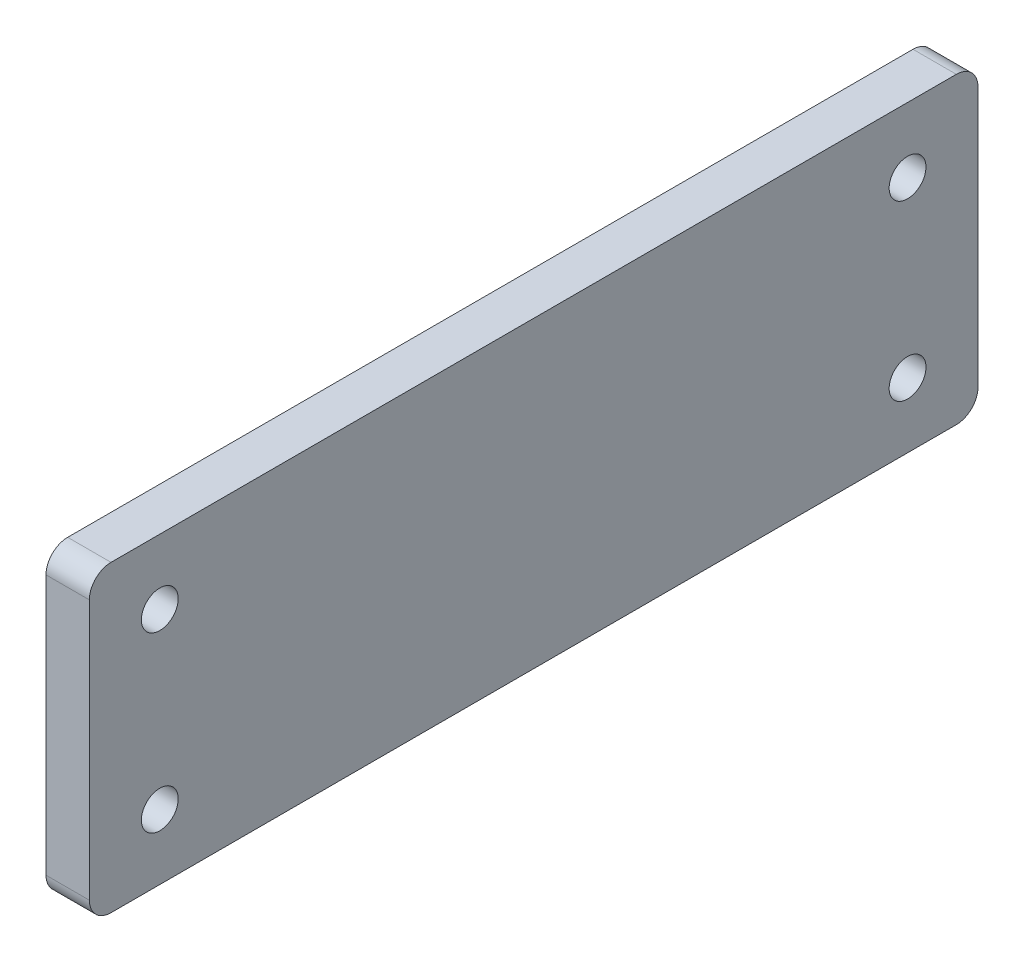
ISO-10303-21;
HEADER;
FILE_DESCRIPTION(('STEP AP214'),'2;1');
FILE_NAME('part.step','',(''),(''),'','','');
FILE_SCHEMA(('AUTOMOTIVE_DESIGN { 1 0 10303 214 1 1 1 1 }'));
ENDSEC;
DATA;
#1=APPLICATION_CONTEXT('core data for automotive mechanical design processes');
#2=APPLICATION_PROTOCOL_DEFINITION('international standard','automotive_design',2000,#1);
#3=PRODUCT_CONTEXT('',#1,'mechanical');
#4=PRODUCT('Part','Part','',(#3));
#5=PRODUCT_RELATED_PRODUCT_CATEGORY('part','',(#4));
#6=PRODUCT_DEFINITION_FORMATION('','',#4);
#7=PRODUCT_DEFINITION_CONTEXT('part definition',#1,'design');
#8=PRODUCT_DEFINITION('design','',#6,#7);
#9=PRODUCT_DEFINITION_SHAPE('','',#8);
#10=(LENGTH_UNIT() NAMED_UNIT(*) SI_UNIT(.MILLI.,.METRE.));
#11=(NAMED_UNIT(*) PLANE_ANGLE_UNIT() SI_UNIT($,.RADIAN.));
#12=(NAMED_UNIT(*) SI_UNIT($,.STERADIAN.) SOLID_ANGLE_UNIT());
#13=UNCERTAINTY_MEASURE_WITH_UNIT(LENGTH_MEASURE(1.E-05),#10,'distance_accuracy_value','');
#14=(GEOMETRIC_REPRESENTATION_CONTEXT(3) GLOBAL_UNCERTAINTY_ASSIGNED_CONTEXT((#13)) GLOBAL_UNIT_ASSIGNED_CONTEXT((#10,
#11,#12)) REPRESENTATION_CONTEXT('',''));
#15=CARTESIAN_POINT('',(0.,0.,0.));
#16=DIRECTION('',(0.,0.,1.));
#17=DIRECTION('',(1.,0.,0.));
#18=AXIS2_PLACEMENT_3D('',#15,#16,#17);
#19=CARTESIAN_POINT('',(2.,-6.,19.5));
#20=DIRECTION('',(1.,0.,0.));
#21=DIRECTION('',(0.,0.,-1.));
#22=AXIS2_PLACEMENT_3D('',#19,#20,#21);
#23=PLANE('',#22);
#24=CARTESIAN_POINT('',(2.,-4.,-17.25));
#25=DIRECTION('',(1.,0.,0.));
#26=DIRECTION('',(0.,0.,-1.));
#27=AXIS2_PLACEMENT_3D('',#24,#25,#26);
#28=CIRCLE('',#27,0.85);
#29=CARTESIAN_POINT('',(2.,-4.,-18.1));
#30=VERTEX_POINT('',#29);
#31=EDGE_CURVE('E189',#30,#30,#28,.T.);
#32=ORIENTED_EDGE('',*,*,#31,.F.);
#33=EDGE_LOOP('',(#32));
#34=FACE_BOUND('',#33,.T.);
#35=CARTESIAN_POINT('',(2.,3.99999999999999,17.25));
#36=DIRECTION('',(1.,0.,0.));
#37=DIRECTION('',(0.,0.,-1.));
#38=AXIS2_PLACEMENT_3D('',#35,#36,#37);
#39=CIRCLE('',#38,0.85);
#40=CARTESIAN_POINT('',(2.,3.99999999999999,16.4));
#41=VERTEX_POINT('',#40);
#42=EDGE_CURVE('E135',#41,#41,#39,.T.);
#43=ORIENTED_EDGE('',*,*,#42,.F.);
#44=EDGE_LOOP('',(#43));
#45=FACE_BOUND('',#44,.T.);
#46=CARTESIAN_POINT('',(2.,-6.,19.5));
#47=DIRECTION('',(1.,0.,0.));
#48=DIRECTION('',(0.,0.,-1.));
#49=AXIS2_PLACEMENT_3D('',#46,#47,#48);
#50=CIRCLE('',#49,1.);
#51=CARTESIAN_POINT('',(2.,-5.99999999999999,20.5));
#52=VERTEX_POINT('',#51);
#53=CARTESIAN_POINT('',(2.,-7.,19.5));
#54=VERTEX_POINT('',#53);
#55=EDGE_CURVE('E146',#52,#54,#50,.T.);
#56=ORIENTED_EDGE('',*,*,#55,.T.);
#57=DIRECTION('',(0.,0.,-1.));
#58=VECTOR('',#57,1.);
#59=CARTESIAN_POINT('',(2.,-7.,19.5));
#60=LINE('',#59,#58);
#61=CARTESIAN_POINT('',(2.,-7.,-19.5));
#62=VERTEX_POINT('',#61);
#63=EDGE_CURVE('E94',#54,#62,#60,.T.);
#64=ORIENTED_EDGE('',*,*,#63,.T.);
#65=CARTESIAN_POINT('',(2.,-5.99999999999999,-19.5));
#66=DIRECTION('',(1.,0.,0.));
#67=DIRECTION('',(0.,0.,-1.));
#68=AXIS2_PLACEMENT_3D('',#65,#66,#67);
#69=CIRCLE('',#68,1.);
#70=CARTESIAN_POINT('',(2.,-5.99999999999999,-20.5));
#71=VERTEX_POINT('',#70);
#72=EDGE_CURVE('E161',#62,#71,#69,.T.);
#73=ORIENTED_EDGE('',*,*,#72,.T.);
#74=DIRECTION('',(0.,1.,0.));
#75=VECTOR('',#74,1.);
#76=CARTESIAN_POINT('',(2.,6.,-20.5));
#77=LINE('',#76,#75);
#78=CARTESIAN_POINT('',(2.,6.,-20.5));
#79=VERTEX_POINT('',#78);
#80=EDGE_CURVE('E174',#71,#79,#77,.T.);
#81=ORIENTED_EDGE('',*,*,#80,.T.);
#82=CARTESIAN_POINT('',(2.,6.00000000000001,-19.5));
#83=DIRECTION('',(1.,0.,0.));
#84=DIRECTION('',(0.,0.,1.));
#85=AXIS2_PLACEMENT_3D('',#82,#83,#84);
#86=CIRCLE('',#85,1.);
#87=CARTESIAN_POINT('',(2.,7.00000000000001,-19.5));
#88=VERTEX_POINT('',#87);
#89=EDGE_CURVE('E113',#79,#88,#86,.T.);
#90=ORIENTED_EDGE('',*,*,#89,.T.);
#91=DIRECTION('',(0.,0.,1.));
#92=VECTOR('',#91,1.);
#93=CARTESIAN_POINT('',(2.,7.,19.5));
#94=LINE('',#93,#92);
#95=CARTESIAN_POINT('',(2.,7.,19.5));
#96=VERTEX_POINT('',#95);
#97=EDGE_CURVE('E107',#88,#96,#94,.T.);
#98=ORIENTED_EDGE('',*,*,#97,.T.);
#99=CARTESIAN_POINT('',(2.,6.,19.5));
#100=DIRECTION('',(1.,0.,0.));
#101=DIRECTION('',(0.,0.,-1.));
#102=AXIS2_PLACEMENT_3D('',#99,#100,#101);
#103=CIRCLE('',#102,1.);
#104=CARTESIAN_POINT('',(2.,5.99999999999999,20.5));
#105=VERTEX_POINT('',#104);
#106=EDGE_CURVE('E111',#96,#105,#103,.T.);
#107=ORIENTED_EDGE('',*,*,#106,.T.);
#108=DIRECTION('',(0.,-1.,0.));
#109=VECTOR('',#108,1.);
#110=CARTESIAN_POINT('',(2.,5.99999999999999,20.5));
#111=LINE('',#110,#109);
#112=EDGE_CURVE('E51',#105,#52,#111,.T.);
#113=ORIENTED_EDGE('',*,*,#112,.T.);
#114=EDGE_LOOP('',(#56,#64,#73,#81,#90,#98,#107,#113));
#115=FACE_BOUND('',#114,.T.);
#116=CARTESIAN_POINT('',(2.,-4.00000000000001,17.25));
#117=DIRECTION('',(1.,0.,0.));
#118=DIRECTION('',(0.,0.,-1.));
#119=AXIS2_PLACEMENT_3D('',#116,#117,#118);
#120=CIRCLE('',#119,0.85);
#121=CARTESIAN_POINT('',(2.,-4.00000000000001,16.4));
#122=VERTEX_POINT('',#121);
#123=EDGE_CURVE('E183',#122,#122,#120,.T.);
#124=ORIENTED_EDGE('',*,*,#123,.F.);
#125=EDGE_LOOP('',(#124));
#126=FACE_BOUND('',#125,.T.);
#127=CARTESIAN_POINT('',(2.,4.,-17.25));
#128=DIRECTION('',(1.,0.,0.));
#129=DIRECTION('',(0.,0.,-1.));
#130=AXIS2_PLACEMENT_3D('',#127,#128,#129);
#131=CIRCLE('',#130,0.85);
#132=CARTESIAN_POINT('',(2.,4.,-18.1));
#133=VERTEX_POINT('',#132);
#134=EDGE_CURVE('E195',#133,#133,#131,.T.);
#135=ORIENTED_EDGE('',*,*,#134,.F.);
#136=EDGE_LOOP('',(#135));
#137=FACE_BOUND('',#136,.T.);
#138=ADVANCED_FACE('F34',(#34,#45,#115,#126,#137),#23,.T.);
#139=CARTESIAN_POINT('',(0.,-6.,19.5));
#140=DIRECTION('',(1.,0.,0.));
#141=DIRECTION('',(0.,0.,-1.));
#142=AXIS2_PLACEMENT_3D('',#139,#140,#141);
#143=PLANE('',#142);
#144=CARTESIAN_POINT('',(0.,-6.,19.5));
#145=DIRECTION('',(1.,0.,0.));
#146=DIRECTION('',(0.,0.,-1.));
#147=AXIS2_PLACEMENT_3D('',#144,#145,#146);
#148=CIRCLE('',#147,1.);
#149=CARTESIAN_POINT('',(0.,-5.99999999999999,20.5));
#150=VERTEX_POINT('',#149);
#151=CARTESIAN_POINT('',(0.,-7.,19.5));
#152=VERTEX_POINT('',#151);
#153=EDGE_CURVE('E131',#150,#152,#148,.T.);
#154=ORIENTED_EDGE('',*,*,#153,.F.);
#155=DIRECTION('',(0.,-1.,0.));
#156=VECTOR('',#155,1.);
#157=CARTESIAN_POINT('',(0.,5.99999999999999,20.5));
#158=LINE('',#157,#156);
#159=CARTESIAN_POINT('',(0.,5.99999999999999,20.5));
#160=VERTEX_POINT('',#159);
#161=EDGE_CURVE('E86',#160,#150,#158,.T.);
#162=ORIENTED_EDGE('',*,*,#161,.F.);
#163=CARTESIAN_POINT('',(0.,6.,19.5));
#164=DIRECTION('',(1.,0.,0.));
#165=DIRECTION('',(0.,0.,-1.));
#166=AXIS2_PLACEMENT_3D('',#163,#164,#165);
#167=CIRCLE('',#166,1.);
#168=CARTESIAN_POINT('',(0.,7.,19.5));
#169=VERTEX_POINT('',#168);
#170=EDGE_CURVE('E80',#169,#160,#167,.T.);
#171=ORIENTED_EDGE('',*,*,#170,.F.);
#172=DIRECTION('',(0.,0.,1.));
#173=VECTOR('',#172,1.);
#174=CARTESIAN_POINT('',(0.,7.,19.5));
#175=LINE('',#174,#173);
#176=CARTESIAN_POINT('',(0.,7.00000000000001,-19.5));
#177=VERTEX_POINT('',#176);
#178=EDGE_CURVE('E121',#177,#169,#175,.T.);
#179=ORIENTED_EDGE('',*,*,#178,.F.);
#180=CARTESIAN_POINT('',(0.,6.00000000000001,-19.5));
#181=DIRECTION('',(1.,0.,0.));
#182=DIRECTION('',(0.,0.,1.));
#183=AXIS2_PLACEMENT_3D('',#180,#181,#182);
#184=CIRCLE('',#183,1.);
#185=CARTESIAN_POINT('',(0.,6.,-20.5));
#186=VERTEX_POINT('',#185);
#187=EDGE_CURVE('E141',#186,#177,#184,.T.);
#188=ORIENTED_EDGE('',*,*,#187,.F.);
#189=DIRECTION('',(0.,1.,0.));
#190=VECTOR('',#189,1.);
#191=CARTESIAN_POINT('',(0.,6.,-20.5));
#192=LINE('',#191,#190);
#193=CARTESIAN_POINT('',(0.,-5.99999999999999,-20.5));
#194=VERTEX_POINT('',#193);
#195=EDGE_CURVE('E139',#194,#186,#192,.T.);
#196=ORIENTED_EDGE('',*,*,#195,.F.);
#197=CARTESIAN_POINT('',(0.,-5.99999999999999,-19.5));
#198=DIRECTION('',(1.,0.,0.));
#199=DIRECTION('',(0.,0.,-1.));
#200=AXIS2_PLACEMENT_3D('',#197,#198,#199);
#201=CIRCLE('',#200,1.);
#202=CARTESIAN_POINT('',(0.,-7.,-19.5));
#203=VERTEX_POINT('',#202);
#204=EDGE_CURVE('E137',#203,#194,#201,.T.);
#205=ORIENTED_EDGE('',*,*,#204,.F.);
#206=DIRECTION('',(0.,0.,-1.));
#207=VECTOR('',#206,1.);
#208=CARTESIAN_POINT('',(0.,-7.,19.5));
#209=LINE('',#208,#207);
#210=EDGE_CURVE('E134',#152,#203,#209,.T.);
#211=ORIENTED_EDGE('',*,*,#210,.F.);
#212=EDGE_LOOP('',(#154,#162,#171,#179,#188,#196,#205,#211));
#213=FACE_BOUND('',#212,.T.);
#214=CARTESIAN_POINT('',(0.,3.99999999999999,17.25));
#215=DIRECTION('',(1.,0.,0.));
#216=DIRECTION('',(0.,0.,-1.));
#217=AXIS2_PLACEMENT_3D('',#214,#215,#216);
#218=CIRCLE('',#217,0.85);
#219=CARTESIAN_POINT('',(0.,3.99999999999999,16.4));
#220=VERTEX_POINT('',#219);
#221=EDGE_CURVE('E180',#220,#220,#218,.T.);
#222=ORIENTED_EDGE('',*,*,#221,.T.);
#223=EDGE_LOOP('',(#222));
#224=FACE_BOUND('',#223,.T.);
#225=CARTESIAN_POINT('',(0.,-4.00000000000001,17.25));
#226=DIRECTION('',(1.,0.,0.));
#227=DIRECTION('',(0.,0.,-1.));
#228=AXIS2_PLACEMENT_3D('',#225,#226,#227);
#229=CIRCLE('',#228,0.85);
#230=CARTESIAN_POINT('',(0.,-4.00000000000001,16.4));
#231=VERTEX_POINT('',#230);
#232=EDGE_CURVE('E186',#231,#231,#229,.T.);
#233=ORIENTED_EDGE('',*,*,#232,.T.);
#234=EDGE_LOOP('',(#233));
#235=FACE_BOUND('',#234,.T.);
#236=CARTESIAN_POINT('',(0.,-4.,-17.25));
#237=DIRECTION('',(1.,0.,0.));
#238=DIRECTION('',(0.,0.,-1.));
#239=AXIS2_PLACEMENT_3D('',#236,#237,#238);
#240=CIRCLE('',#239,0.85);
#241=CARTESIAN_POINT('',(0.,-4.,-18.1));
#242=VERTEX_POINT('',#241);
#243=EDGE_CURVE('E192',#242,#242,#240,.T.);
#244=ORIENTED_EDGE('',*,*,#243,.T.);
#245=EDGE_LOOP('',(#244));
#246=FACE_BOUND('',#245,.T.);
#247=CARTESIAN_POINT('',(0.,4.,-17.25));
#248=DIRECTION('',(1.,0.,0.));
#249=DIRECTION('',(0.,0.,-1.));
#250=AXIS2_PLACEMENT_3D('',#247,#248,#249);
#251=CIRCLE('',#250,0.85);
#252=CARTESIAN_POINT('',(0.,4.,-18.1));
#253=VERTEX_POINT('',#252);
#254=EDGE_CURVE('E198',#253,#253,#251,.T.);
#255=ORIENTED_EDGE('',*,*,#254,.T.);
#256=EDGE_LOOP('',(#255));
#257=FACE_BOUND('',#256,.T.);
#258=ADVANCED_FACE('F165',(#213,#224,#235,#246,#257),#143,.F.);
#259=CARTESIAN_POINT('',(2.,-6.,19.5));
#260=DIRECTION('',(-1.,0.,0.));
#261=DIRECTION('',(0.,0.,1.));
#262=AXIS2_PLACEMENT_3D('',#259,#260,#261);
#263=CYLINDRICAL_SURFACE('',#262,1.);
#264=ORIENTED_EDGE('',*,*,#153,.T.);
#265=DIRECTION('',(-1.,0.,0.));
#266=VECTOR('',#265,1.);
#267=CARTESIAN_POINT('',(2.,-7.,19.5));
#268=LINE('',#267,#266);
#269=EDGE_CURVE('E11',#54,#152,#268,.T.);
#270=ORIENTED_EDGE('',*,*,#269,.F.);
#271=ORIENTED_EDGE('',*,*,#55,.F.);
#272=DIRECTION('',(-1.,0.,0.));
#273=VECTOR('',#272,1.);
#274=CARTESIAN_POINT('',(2.,-5.99999999999999,20.5));
#275=LINE('',#274,#273);
#276=EDGE_CURVE('E127',#52,#150,#275,.T.);
#277=ORIENTED_EDGE('',*,*,#276,.T.);
#278=EDGE_LOOP('',(#264,#270,#271,#277));
#279=FACE_BOUND('',#278,.T.);
#280=ADVANCED_FACE('F36',(#279),#263,.T.);
#281=CARTESIAN_POINT('',(2.,-7.,19.5));
#282=DIRECTION('',(0.,1.,0.));
#283=DIRECTION('',(0.,0.,1.));
#284=AXIS2_PLACEMENT_3D('',#281,#282,#283);
#285=PLANE('',#284);
#286=ORIENTED_EDGE('',*,*,#210,.T.);
#287=DIRECTION('',(-1.,0.,0.));
#288=VECTOR('',#287,1.);
#289=CARTESIAN_POINT('',(2.,-7.,-19.5));
#290=LINE('',#289,#288);
#291=EDGE_CURVE('E43',#62,#203,#290,.T.);
#292=ORIENTED_EDGE('',*,*,#291,.F.);
#293=ORIENTED_EDGE('',*,*,#63,.F.);
#294=ORIENTED_EDGE('',*,*,#269,.T.);
#295=EDGE_LOOP('',(#286,#292,#293,#294));
#296=FACE_BOUND('',#295,.T.);
#297=ADVANCED_FACE('F232',(#296),#285,.F.);
#298=CARTESIAN_POINT('',(2.,-5.99999999999999,-19.5));
#299=DIRECTION('',(-1.,0.,0.));
#300=DIRECTION('',(0.,0.,1.));
#301=AXIS2_PLACEMENT_3D('',#298,#299,#300);
#302=CYLINDRICAL_SURFACE('',#301,1.);
#303=ORIENTED_EDGE('',*,*,#204,.T.);
#304=DIRECTION('',(-1.,0.,0.));
#305=VECTOR('',#304,1.);
#306=CARTESIAN_POINT('',(2.,-5.99999999999999,-20.5));
#307=LINE('',#306,#305);
#308=EDGE_CURVE('E153',#71,#194,#307,.T.);
#309=ORIENTED_EDGE('',*,*,#308,.F.);
#310=ORIENTED_EDGE('',*,*,#72,.F.);
#311=ORIENTED_EDGE('',*,*,#291,.T.);
#312=EDGE_LOOP('',(#303,#309,#310,#311));
#313=FACE_BOUND('',#312,.T.);
#314=ADVANCED_FACE('F159',(#313),#302,.T.);
#315=CARTESIAN_POINT('',(2.,6.,-20.5));
#316=DIRECTION('',(0.,0.,1.));
#317=DIRECTION('',(1.,0.,0.));
#318=AXIS2_PLACEMENT_3D('',#315,#316,#317);
#319=PLANE('',#318);
#320=ORIENTED_EDGE('',*,*,#195,.T.);
#321=DIRECTION('',(-1.,0.,0.));
#322=VECTOR('',#321,1.);
#323=CARTESIAN_POINT('',(2.,6.,-20.5));
#324=LINE('',#323,#322);
#325=EDGE_CURVE('E150',#79,#186,#324,.T.);
#326=ORIENTED_EDGE('',*,*,#325,.F.);
#327=ORIENTED_EDGE('',*,*,#80,.F.);
#328=ORIENTED_EDGE('',*,*,#308,.T.);
#329=EDGE_LOOP('',(#320,#326,#327,#328));
#330=FACE_BOUND('',#329,.T.);
#331=ADVANCED_FACE('F170',(#330),#319,.F.);
#332=CARTESIAN_POINT('',(2.,6.00000000000001,-19.5));
#333=DIRECTION('',(-1.,0.,0.));
#334=DIRECTION('',(0.,0.,1.));
#335=AXIS2_PLACEMENT_3D('',#332,#333,#334);
#336=CYLINDRICAL_SURFACE('',#335,1.);
#337=ORIENTED_EDGE('',*,*,#187,.T.);
#338=DIRECTION('',(-1.,0.,0.));
#339=VECTOR('',#338,1.);
#340=CARTESIAN_POINT('',(2.,7.00000000000001,-19.5));
#341=LINE('',#340,#339);
#342=EDGE_CURVE('E122',#88,#177,#341,.T.);
#343=ORIENTED_EDGE('',*,*,#342,.F.);
#344=ORIENTED_EDGE('',*,*,#89,.F.);
#345=ORIENTED_EDGE('',*,*,#325,.T.);
#346=EDGE_LOOP('',(#337,#343,#344,#345));
#347=FACE_BOUND('',#346,.T.);
#348=ADVANCED_FACE('F173',(#347),#336,.T.);
#349=CARTESIAN_POINT('',(2.,7.,19.5));
#350=DIRECTION('',(0.,-1.,0.));
#351=DIRECTION('',(0.,0.,-1.));
#352=AXIS2_PLACEMENT_3D('',#349,#350,#351);
#353=PLANE('',#352);
#354=ORIENTED_EDGE('',*,*,#178,.T.);
#355=DIRECTION('',(-1.,0.,0.));
#356=VECTOR('',#355,1.);
#357=CARTESIAN_POINT('',(2.,7.,19.5));
#358=LINE('',#357,#356);
#359=EDGE_CURVE('E118',#96,#169,#358,.T.);
#360=ORIENTED_EDGE('',*,*,#359,.F.);
#361=ORIENTED_EDGE('',*,*,#97,.F.);
#362=ORIENTED_EDGE('',*,*,#342,.T.);
#363=EDGE_LOOP('',(#354,#360,#361,#362));
#364=FACE_BOUND('',#363,.T.);
#365=ADVANCED_FACE('F119',(#364),#353,.F.);
#366=CARTESIAN_POINT('',(2.,6.,19.5));
#367=DIRECTION('',(-1.,0.,0.));
#368=DIRECTION('',(0.,0.,1.));
#369=AXIS2_PLACEMENT_3D('',#366,#367,#368);
#370=CYLINDRICAL_SURFACE('',#369,1.);
#371=ORIENTED_EDGE('',*,*,#170,.T.);
#372=DIRECTION('',(-1.,0.,0.));
#373=VECTOR('',#372,1.);
#374=CARTESIAN_POINT('',(2.,5.99999999999999,20.5));
#375=LINE('',#374,#373);
#376=EDGE_CURVE('E123',#105,#160,#375,.T.);
#377=ORIENTED_EDGE('',*,*,#376,.F.);
#378=ORIENTED_EDGE('',*,*,#106,.F.);
#379=ORIENTED_EDGE('',*,*,#359,.T.);
#380=EDGE_LOOP('',(#371,#377,#378,#379));
#381=FACE_BOUND('',#380,.T.);
#382=ADVANCED_FACE('F125',(#381),#370,.T.);
#383=CARTESIAN_POINT('',(2.,5.99999999999999,20.5));
#384=DIRECTION('',(0.,0.,-1.));
#385=DIRECTION('',(-1.,0.,0.));
#386=AXIS2_PLACEMENT_3D('',#383,#384,#385);
#387=PLANE('',#386);
#388=ORIENTED_EDGE('',*,*,#161,.T.);
#389=ORIENTED_EDGE('',*,*,#276,.F.);
#390=ORIENTED_EDGE('',*,*,#112,.F.);
#391=ORIENTED_EDGE('',*,*,#376,.T.);
#392=EDGE_LOOP('',(#388,#389,#390,#391));
#393=FACE_BOUND('',#392,.T.);
#394=ADVANCED_FACE('F220',(#393),#387,.F.);
#395=CARTESIAN_POINT('',(2.,3.99999999999999,17.25));
#396=DIRECTION('',(-1.,0.,0.));
#397=DIRECTION('',(0.,0.,1.));
#398=AXIS2_PLACEMENT_3D('',#395,#396,#397);
#399=CYLINDRICAL_SURFACE('',#398,0.85);
#400=ORIENTED_EDGE('',*,*,#42,.T.);
#401=EDGE_LOOP('',(#400));
#402=FACE_BOUND('',#401,.T.);
#403=ORIENTED_EDGE('',*,*,#221,.F.);
#404=EDGE_LOOP('',(#403));
#405=FACE_BOUND('',#404,.T.);
#406=ADVANCED_FACE('F217',(#402,#405),#399,.F.);
#407=CARTESIAN_POINT('',(2.,-4.00000000000001,17.25));
#408=DIRECTION('',(-1.,0.,0.));
#409=DIRECTION('',(0.,0.,1.));
#410=AXIS2_PLACEMENT_3D('',#407,#408,#409);
#411=CYLINDRICAL_SURFACE('',#410,0.85);
#412=ORIENTED_EDGE('',*,*,#123,.T.);
#413=EDGE_LOOP('',(#412));
#414=FACE_BOUND('',#413,.T.);
#415=ORIENTED_EDGE('',*,*,#232,.F.);
#416=EDGE_LOOP('',(#415));
#417=FACE_BOUND('',#416,.T.);
#418=ADVANCED_FACE('F296',(#414,#417),#411,.F.);
#419=CARTESIAN_POINT('',(2.,-4.,-17.25));
#420=DIRECTION('',(-1.,0.,0.));
#421=DIRECTION('',(0.,0.,1.));
#422=AXIS2_PLACEMENT_3D('',#419,#420,#421);
#423=CYLINDRICAL_SURFACE('',#422,0.85);
#424=ORIENTED_EDGE('',*,*,#31,.T.);
#425=EDGE_LOOP('',(#424));
#426=FACE_BOUND('',#425,.T.);
#427=ORIENTED_EDGE('',*,*,#243,.F.);
#428=EDGE_LOOP('',(#427));
#429=FACE_BOUND('',#428,.T.);
#430=ADVANCED_FACE('F304',(#426,#429),#423,.F.);
#431=CARTESIAN_POINT('',(2.,4.,-17.25));
#432=DIRECTION('',(-1.,0.,0.));
#433=DIRECTION('',(0.,0.,1.));
#434=AXIS2_PLACEMENT_3D('',#431,#432,#433);
#435=CYLINDRICAL_SURFACE('',#434,0.85);
#436=ORIENTED_EDGE('',*,*,#134,.T.);
#437=EDGE_LOOP('',(#436));
#438=FACE_BOUND('',#437,.T.);
#439=ORIENTED_EDGE('',*,*,#254,.F.);
#440=EDGE_LOOP('',(#439));
#441=FACE_BOUND('',#440,.T.);
#442=ADVANCED_FACE('F204',(#438,#441),#435,.F.);
#443=CLOSED_SHELL('',(#138,#258,#280,#297,#314,#331,#348,#365,#382,#394,#406,#418,#430,#442));
#444=MANIFOLD_SOLID_BREP('B2',#443);
#445=ADVANCED_BREP_SHAPE_REPRESENTATION('',(#18,#444),#14);
#446=SHAPE_DEFINITION_REPRESENTATION(#9,#445);
ENDSEC;
END-ISO-10303-21;
